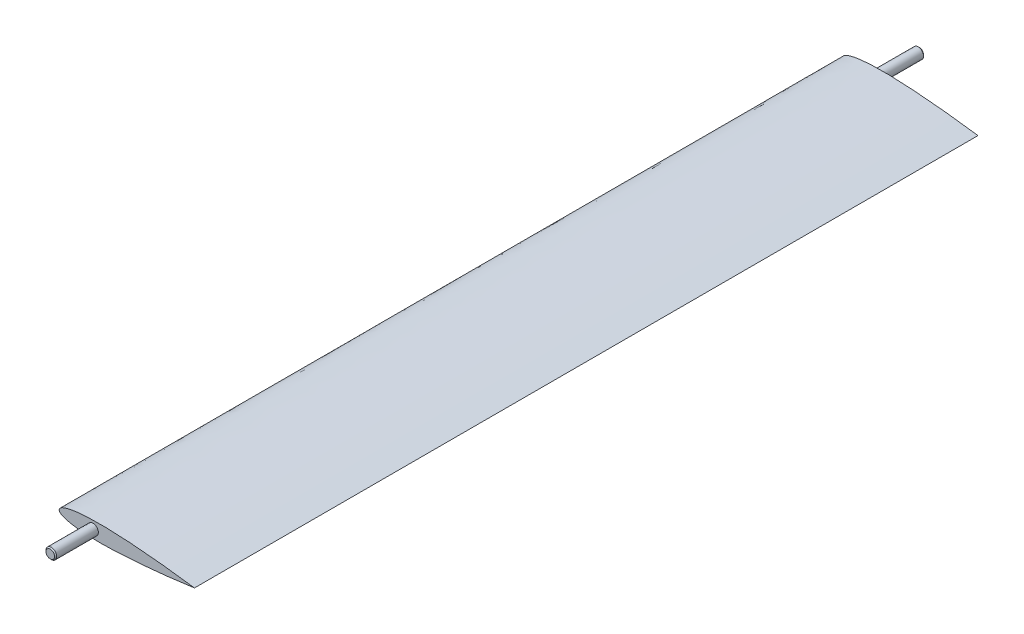
ISO-10303-21;
HEADER;
FILE_DESCRIPTION(('STEP AP214'),'2;1');
FILE_NAME('part.step','',(''),(''),'','','');
FILE_SCHEMA(('AUTOMOTIVE_DESIGN { 1 0 10303 214 1 1 1 1 }'));
ENDSEC;
DATA;
#1=APPLICATION_CONTEXT('core data for automotive mechanical design processes');
#2=APPLICATION_PROTOCOL_DEFINITION('international standard','automotive_design',2000,#1);
#3=PRODUCT_CONTEXT('',#1,'mechanical');
#4=PRODUCT('Part','Part','',(#3));
#5=PRODUCT_RELATED_PRODUCT_CATEGORY('part','',(#4));
#6=PRODUCT_DEFINITION_FORMATION('','',#4);
#7=PRODUCT_DEFINITION_CONTEXT('part definition',#1,'design');
#8=PRODUCT_DEFINITION('design','',#6,#7);
#9=PRODUCT_DEFINITION_SHAPE('','',#8);
#10=(LENGTH_UNIT() NAMED_UNIT(*) SI_UNIT(.MILLI.,.METRE.));
#11=(NAMED_UNIT(*) PLANE_ANGLE_UNIT() SI_UNIT($,.RADIAN.));
#12=(NAMED_UNIT(*) SI_UNIT($,.STERADIAN.) SOLID_ANGLE_UNIT());
#13=UNCERTAINTY_MEASURE_WITH_UNIT(LENGTH_MEASURE(1.E-05),#10,'distance_accuracy_value','');
#14=(GEOMETRIC_REPRESENTATION_CONTEXT(3) GLOBAL_UNCERTAINTY_ASSIGNED_CONTEXT((#13)) GLOBAL_UNIT_ASSIGNED_CONTEXT((#10,
#11,#12)) REPRESENTATION_CONTEXT('',''));
#15=CARTESIAN_POINT('',(0.,0.,0.));
#16=DIRECTION('',(0.,0.,1.));
#17=DIRECTION('',(1.,0.,0.));
#18=AXIS2_PLACEMENT_3D('',#15,#16,#17);
#19=CARTESIAN_POINT('',(18.7294114709245,-2.02546097018375,220.));
#20=DIRECTION('',(0.,0.,-1.));
#21=DIRECTION('',(-1.,0.,0.));
#22=AXIS2_PLACEMENT_3D('',#19,#20,#21);
#23=PLANE('',#22);
#24=CARTESIAN_POINT('',(9.5,0.,220.));
#25=DIRECTION('',(0.,0.,1.));
#26=DIRECTION('',(1.,0.,0.));
#27=AXIS2_PLACEMENT_3D('',#24,#25,#26);
#28=CIRCLE('',#27,1.5);
#29=CARTESIAN_POINT('',(11.,0.,220.));
#30=VERTEX_POINT('',#29);
#31=EDGE_CURVE('E224',#30,#30,#28,.T.);
#32=ORIENTED_EDGE('',*,*,#31,.F.);
#33=EDGE_LOOP('',(#32));
#34=FACE_BOUND('',#33,.T.);
#35=CARTESIAN_POINT('',(0.,0.,220.));
#36=CARTESIAN_POINT('',(-2.06911043078989E-06,-0.0338271220744024,220.));
#37=CARTESIAN_POINT('',(0.00403635311589506,-0.0876126358261565,220.));
#38=CARTESIAN_POINT('',(0.0188200562314085,-0.16185952748104,220.));
#39=CARTESIAN_POINT('',(0.0528501374643438,-0.253807517152681,220.));
#40=CARTESIAN_POINT('',(0.0947639989089038,-0.335316282668944,220.));
#41=CARTESIAN_POINT('',(0.15338616112402,-0.422711030479261,220.));
#42=CARTESIAN_POINT('',(0.236871710244544,-0.52106112737417,220.));
#43=CARTESIAN_POINT('',(0.360534512107286,-0.637189828483682,220.));
#44=CARTESIAN_POINT('',(0.549922371934611,-0.778618130341983,220.));
#45=CARTESIAN_POINT('',(0.852612628758095,-0.955990781417369,220.));
#46=CARTESIAN_POINT('',(1.33838174306882,-1.17360275032431,220.));
#47=CARTESIAN_POINT('',(2.12699066008119,-1.43620111728422,220.));
#48=CARTESIAN_POINT('',(3.44482494289274,-1.74535253826911,220.));
#49=CARTESIAN_POINT('',(5.3548767518104,-2.02711778446599,220.));
#50=CARTESIAN_POINT('',(7.77648688230715,-2.21985110884306,220.));
#51=CARTESIAN_POINT('',(10.5668143291997,-2.29867233686225,220.));
#52=CARTESIAN_POINT('',(13.467597852255,-2.27257110734628,220.));
#53=CARTESIAN_POINT('',(16.365165054022,-2.16727804219762,220.));
#54=CARTESIAN_POINT('',(19.2618490057873,-2.0013941708966,220.));
#55=CARTESIAN_POINT('',(21.7903998693664,-1.81523611830651,220.));
#56=CARTESIAN_POINT('',(23.9609885468039,-1.63075430288549,220.));
#57=CARTESIAN_POINT('',(25.7603134392892,-1.46376214884123,220.));
#58=CARTESIAN_POINT('',(27.2130418254588,-1.31996191843635,220.));
#59=CARTESIAN_POINT('',(28.9962984932699,-1.13500204529733,220.));
#60=CARTESIAN_POINT('',(30.8335668017185,-0.929187427247665,220.));
#61=CARTESIAN_POINT('',(32.5761475222131,-0.724154030900604,220.));
#62=CARTESIAN_POINT('',(34.4560407912972,-0.485464125489337,220.));
#63=CARTESIAN_POINT('',(35.7518272945925,-0.316113949746015,220.));
#64=CARTESIAN_POINT('',(37.0154592080796,-0.1398168008867,220.));
#65=CARTESIAN_POINT('',(37.6653217295886,-0.0470317833553604,220.));
#66=CARTESIAN_POINT('',(37.9888626445753,0.,220.));
#67=B_SPLINE_CURVE_WITH_KNOTS('',4,(#35,#36,#37,#38,#39,#40,#41,#42,#43,#44,#45,#46,#47,#48,#49,
#50,#51,#52,#53,#54,#55,#56,#57,#58,#59,#60,#61,#62,#63,#64,#65,#66),.UNSPECIFIED.,.F.,.F.,(5,1,
1,1,1,1,1,1,1,1,1,1,1,1,1,1,1,1,1,1,1,1,1,1,1,1,1,1,5),(0.,0.00316426122429357,
0.00506597876066756,0.00706776862449813,0.00918264952031766,0.0117519393359825,
0.0149267219917482,0.0191568446730158,0.0250795578902756,0.0339028131203275,0.0478066699856344,
0.0690496221158944,0.103020549952279,0.160853133365884,0.228931700635829,0.297010267730831,
0.365088836221598,0.433167405753562,0.501245974599692,0.569324543477579,0.603363828114539,
0.6374031127515,0.671442397407792,0.705481682064084,0.773560250012226,0.80759953409959,
0.841638818186954,0.875678103898654,0.90942695583692),.UNSPECIFIED.);
#68=CARTESIAN_POINT('',(0.,0.,220.));
#69=VERTEX_POINT('',#68);
#70=CARTESIAN_POINT('',(37.9888626445753,0.,220.));
#71=VERTEX_POINT('',#70);
#72=EDGE_CURVE('E185',#69,#71,#67,.T.);
#73=ORIENTED_EDGE('',*,*,#72,.T.);
#74=CARTESIAN_POINT('',(37.9888626445753,0.,220.));
#75=CARTESIAN_POINT('',(37.6653217295886,0.0470317833553604,220.));
#76=CARTESIAN_POINT('',(37.0154592080796,0.1398168008867,220.));
#77=CARTESIAN_POINT('',(35.7518272945925,0.316113949746015,220.));
#78=CARTESIAN_POINT('',(34.4560407912972,0.485464125489337,220.));
#79=CARTESIAN_POINT('',(32.5761475222131,0.724154030900604,220.));
#80=CARTESIAN_POINT('',(30.8335668017185,0.929187427247665,220.));
#81=CARTESIAN_POINT('',(28.9962984932699,1.13500204529733,220.));
#82=CARTESIAN_POINT('',(27.2130418254588,1.31996191843635,220.));
#83=CARTESIAN_POINT('',(25.7603134392892,1.46376214884123,220.));
#84=CARTESIAN_POINT('',(23.9609885468039,1.63075430288549,220.));
#85=CARTESIAN_POINT('',(21.7903998693664,1.81523611830651,220.));
#86=CARTESIAN_POINT('',(19.2618490057873,2.0013941708966,220.));
#87=CARTESIAN_POINT('',(16.365165054022,2.16727804219762,220.));
#88=CARTESIAN_POINT('',(13.467597852255,2.27257110734628,220.));
#89=CARTESIAN_POINT('',(10.5668143291997,2.29867233686225,220.));
#90=CARTESIAN_POINT('',(7.77648688230715,2.21985110884306,220.));
#91=CARTESIAN_POINT('',(5.3548767518104,2.02711778446599,220.));
#92=CARTESIAN_POINT('',(3.44482494289274,1.74535253826911,220.));
#93=CARTESIAN_POINT('',(2.12699066008119,1.43620111728422,220.));
#94=CARTESIAN_POINT('',(1.33838174306882,1.17360275032431,220.));
#95=CARTESIAN_POINT('',(0.852612628758095,0.955990781417369,220.));
#96=CARTESIAN_POINT('',(0.549922371934611,0.778618130341983,220.));
#97=CARTESIAN_POINT('',(0.360534512107286,0.637189828483682,220.));
#98=CARTESIAN_POINT('',(0.236871710244544,0.52106112737417,220.));
#99=CARTESIAN_POINT('',(0.15338616112402,0.422711030479261,220.));
#100=CARTESIAN_POINT('',(0.0947639989089038,0.335316282668944,220.));
#101=CARTESIAN_POINT('',(0.0528501374643438,0.253807517152681,220.));
#102=CARTESIAN_POINT('',(0.0188200562314085,0.16185952748104,220.));
#103=CARTESIAN_POINT('',(0.00403635311589506,0.0876126358261565,220.));
#104=CARTESIAN_POINT('',(-2.06911043078989E-06,0.0338271220744024,220.));
#105=CARTESIAN_POINT('',(0.,0.,220.));
#106=B_SPLINE_CURVE_WITH_KNOTS('',4,(#74,#75,#76,#77,#78,#79,#80,#81,#82,#83,#84,#85,#86,#87,
#88,#89,#90,#91,#92,#93,#94,#95,#96,#97,#98,#99,#100,#101,#102,#103,#104,#105),.UNSPECIFIED.,
.F.,.F.,(5,1,1,1,1,1,1,1,1,1,1,1,1,1,1,1,1,1,1,1,1,1,1,1,1,1,1,1,5),(0.,0.0337488519382667,
0.0677881376499663,0.101827421737331,0.135866705824695,0.203945273772837,0.237984558429129,
0.272023843085421,0.306063127722381,0.340102412359342,0.408180981237228,0.476259550083358,
0.544338119615323,0.612416688106089,0.680495255201092,0.748573822471036,0.806406405884641,
0.840377333721026,0.861620285851286,0.875524142716593,0.884347397946645,0.890270111163905,
0.894500233845172,0.897675016500938,0.900244306316603,0.902359187212422,0.904360977076253,
0.906262694612627,0.90942695583692),.UNSPECIFIED.);
#107=EDGE_CURVE('E187',#71,#69,#106,.T.);
#108=ORIENTED_EDGE('',*,*,#107,.T.);
#109=EDGE_LOOP('',(#73,#108));
#110=FACE_BOUND('',#109,.T.);
#111=ADVANCED_FACE('F45',(#34,#110),#23,.F.);
#112=CARTESIAN_POINT('',(18.7294114709245,-2.02546097018375,0.));
#113=DIRECTION('',(0.,0.,-1.));
#114=DIRECTION('',(-1.,0.,0.));
#115=AXIS2_PLACEMENT_3D('',#112,#113,#114);
#116=PLANE('',#115);
#117=CARTESIAN_POINT('',(9.5,0.,0.));
#118=DIRECTION('',(0.,0.,-1.));
#119=DIRECTION('',(-1.,0.,0.));
#120=AXIS2_PLACEMENT_3D('',#117,#118,#119);
#121=CIRCLE('',#120,1.5);
#122=CARTESIAN_POINT('',(8.,0.,0.));
#123=VERTEX_POINT('',#122);
#124=EDGE_CURVE('E120',#123,#123,#121,.T.);
#125=ORIENTED_EDGE('',*,*,#124,.F.);
#126=EDGE_LOOP('',(#125));
#127=FACE_BOUND('',#126,.T.);
#128=CARTESIAN_POINT('',(0.,0.,0.));
#129=CARTESIAN_POINT('',(-2.06911043078989E-06,-0.0338271220744024,0.));
#130=CARTESIAN_POINT('',(0.00403635311589506,-0.0876126358261565,0.));
#131=CARTESIAN_POINT('',(0.0188200562314085,-0.16185952748104,0.));
#132=CARTESIAN_POINT('',(0.0528501374643438,-0.253807517152681,0.));
#133=CARTESIAN_POINT('',(0.0947639989089038,-0.335316282668944,0.));
#134=CARTESIAN_POINT('',(0.15338616112402,-0.422711030479261,0.));
#135=CARTESIAN_POINT('',(0.236871710244544,-0.52106112737417,0.));
#136=CARTESIAN_POINT('',(0.360534512107286,-0.637189828483682,0.));
#137=CARTESIAN_POINT('',(0.549922371934611,-0.778618130341983,0.));
#138=CARTESIAN_POINT('',(0.852612628758095,-0.955990781417369,0.));
#139=CARTESIAN_POINT('',(1.33838174306882,-1.17360275032431,0.));
#140=CARTESIAN_POINT('',(2.12699066008119,-1.43620111728422,0.));
#141=CARTESIAN_POINT('',(3.44482494289274,-1.74535253826911,0.));
#142=CARTESIAN_POINT('',(5.3548767518104,-2.02711778446599,0.));
#143=CARTESIAN_POINT('',(7.77648688230715,-2.21985110884306,0.));
#144=CARTESIAN_POINT('',(10.5668143291997,-2.29867233686225,0.));
#145=CARTESIAN_POINT('',(13.467597852255,-2.27257110734628,0.));
#146=CARTESIAN_POINT('',(16.365165054022,-2.16727804219762,0.));
#147=CARTESIAN_POINT('',(19.2618490057873,-2.0013941708966,0.));
#148=CARTESIAN_POINT('',(21.7903998693664,-1.81523611830651,0.));
#149=CARTESIAN_POINT('',(23.9609885468039,-1.63075430288549,0.));
#150=CARTESIAN_POINT('',(25.7603134392892,-1.46376214884123,0.));
#151=CARTESIAN_POINT('',(27.2130418254588,-1.31996191843635,0.));
#152=CARTESIAN_POINT('',(28.9962984932699,-1.13500204529733,0.));
#153=CARTESIAN_POINT('',(30.8335668017185,-0.929187427247665,0.));
#154=CARTESIAN_POINT('',(32.5761475222131,-0.724154030900604,0.));
#155=CARTESIAN_POINT('',(34.4560407912972,-0.485464125489337,0.));
#156=CARTESIAN_POINT('',(35.7518272945925,-0.316113949746015,0.));
#157=CARTESIAN_POINT('',(37.0154592080796,-0.1398168008867,0.));
#158=CARTESIAN_POINT('',(37.6653217295886,-0.0470317833553604,0.));
#159=CARTESIAN_POINT('',(37.9888626445753,0.,0.));
#160=B_SPLINE_CURVE_WITH_KNOTS('',4,(#128,#129,#130,#131,#132,#133,#134,#135,#136,#137,#138,
#139,#140,#141,#142,#143,#144,#145,#146,#147,#148,#149,#150,#151,#152,#153,#154,#155,#156,#157,
#158,#159),.UNSPECIFIED.,.F.,.F.,(5,1,1,1,1,1,1,1,1,1,1,1,1,1,1,1,1,1,1,1,1,1,1,1,1,1,1,1,5),
(0.,0.00316426122429357,0.00506597876066756,0.00706776862449813,0.00918264952031766,
0.0117519393359825,0.0149267219917482,0.0191568446730158,0.0250795578902756,0.0339028131203275,
0.0478066699856344,0.0690496221158944,0.103020549952279,0.160853133365884,0.228931700635829,
0.297010267730831,0.365088836221598,0.433167405753562,0.501245974599692,0.569324543477579,
0.603363828114539,0.6374031127515,0.671442397407792,0.705481682064084,0.773560250012226,
0.80759953409959,0.841638818186954,0.875678103898654,0.90942695583692),.UNSPECIFIED.);
#161=CARTESIAN_POINT('',(0.,0.,0.));
#162=VERTEX_POINT('',#161);
#163=CARTESIAN_POINT('',(37.9888626445753,0.,0.));
#164=VERTEX_POINT('',#163);
#165=EDGE_CURVE('E181',#162,#164,#160,.T.);
#166=ORIENTED_EDGE('',*,*,#165,.F.);
#167=CARTESIAN_POINT('',(37.9888626445753,0.,0.));
#168=CARTESIAN_POINT('',(37.6653217295886,0.0470317833553604,0.));
#169=CARTESIAN_POINT('',(37.0154592080796,0.1398168008867,0.));
#170=CARTESIAN_POINT('',(35.7518272945925,0.316113949746015,0.));
#171=CARTESIAN_POINT('',(34.4560407912972,0.485464125489337,0.));
#172=CARTESIAN_POINT('',(32.5761475222131,0.724154030900604,0.));
#173=CARTESIAN_POINT('',(30.8335668017185,0.929187427247665,0.));
#174=CARTESIAN_POINT('',(28.9962984932699,1.13500204529733,0.));
#175=CARTESIAN_POINT('',(27.2130418254588,1.31996191843635,0.));
#176=CARTESIAN_POINT('',(25.7603134392892,1.46376214884123,0.));
#177=CARTESIAN_POINT('',(23.9609885468039,1.63075430288549,0.));
#178=CARTESIAN_POINT('',(21.7903998693664,1.81523611830651,0.));
#179=CARTESIAN_POINT('',(19.2618490057873,2.0013941708966,0.));
#180=CARTESIAN_POINT('',(16.365165054022,2.16727804219762,0.));
#181=CARTESIAN_POINT('',(13.467597852255,2.27257110734628,0.));
#182=CARTESIAN_POINT('',(10.5668143291997,2.29867233686225,0.));
#183=CARTESIAN_POINT('',(7.77648688230715,2.21985110884306,0.));
#184=CARTESIAN_POINT('',(5.3548767518104,2.02711778446599,0.));
#185=CARTESIAN_POINT('',(3.44482494289274,1.74535253826911,0.));
#186=CARTESIAN_POINT('',(2.12699066008119,1.43620111728422,0.));
#187=CARTESIAN_POINT('',(1.33838174306882,1.17360275032431,0.));
#188=CARTESIAN_POINT('',(0.852612628758095,0.955990781417369,0.));
#189=CARTESIAN_POINT('',(0.549922371934611,0.778618130341983,0.));
#190=CARTESIAN_POINT('',(0.360534512107286,0.637189828483682,0.));
#191=CARTESIAN_POINT('',(0.236871710244544,0.52106112737417,0.));
#192=CARTESIAN_POINT('',(0.15338616112402,0.422711030479261,0.));
#193=CARTESIAN_POINT('',(0.0947639989089038,0.335316282668944,0.));
#194=CARTESIAN_POINT('',(0.0528501374643438,0.253807517152681,0.));
#195=CARTESIAN_POINT('',(0.0188200562314085,0.16185952748104,0.));
#196=CARTESIAN_POINT('',(0.00403635311589506,0.0876126358261565,0.));
#197=CARTESIAN_POINT('',(-2.06911043078989E-06,0.0338271220744024,0.));
#198=CARTESIAN_POINT('',(0.,0.,0.));
#199=B_SPLINE_CURVE_WITH_KNOTS('',4,(#167,#168,#169,#170,#171,#172,#173,#174,#175,#176,#177,
#178,#179,#180,#181,#182,#183,#184,#185,#186,#187,#188,#189,#190,#191,#192,#193,#194,#195,#196,
#197,#198),.UNSPECIFIED.,.F.,.F.,(5,1,1,1,1,1,1,1,1,1,1,1,1,1,1,1,1,1,1,1,1,1,1,1,1,1,1,1,5),
(0.,0.0337488519382667,0.0677881376499663,0.101827421737331,0.135866705824695,0.203945273772837,
0.237984558429129,0.272023843085421,0.306063127722381,0.340102412359342,0.408180981237228,
0.476259550083358,0.544338119615323,0.612416688106089,0.680495255201092,0.748573822471036,
0.806406405884641,0.840377333721026,0.861620285851286,0.875524142716593,0.884347397946645,
0.890270111163905,0.894500233845172,0.897675016500938,0.900244306316603,0.902359187212422,
0.904360977076253,0.906262694612627,0.90942695583692),.UNSPECIFIED.);
#200=EDGE_CURVE('E191',#164,#162,#199,.T.);
#201=ORIENTED_EDGE('',*,*,#200,.F.);
#202=EDGE_LOOP('',(#166,#201));
#203=FACE_BOUND('',#202,.T.);
#204=ADVANCED_FACE('F202',(#127,#203),#116,.T.);
#205=DIRECTION('',(0.,0.,-1.));
#206=VECTOR('',#205,1.);
#207=SURFACE_OF_LINEAR_EXTRUSION('',#67,#206);
#208=DIRECTION('',(0.,0.,-1.));
#209=VECTOR('',#208,1.);
#210=CARTESIAN_POINT('',(0.,0.,220.));
#211=LINE('',#210,#209);
#212=EDGE_CURVE('E239',#69,#162,#211,.T.);
#213=ORIENTED_EDGE('',*,*,#212,.T.);
#214=ORIENTED_EDGE('',*,*,#165,.T.);
#215=DIRECTION('',(0.,0.,-1.));
#216=VECTOR('',#215,1.);
#217=CARTESIAN_POINT('',(37.9888626445753,0.,220.));
#218=LINE('',#217,#216);
#219=EDGE_CURVE('E226',#71,#164,#218,.T.);
#220=ORIENTED_EDGE('',*,*,#219,.F.);
#221=ORIENTED_EDGE('',*,*,#72,.F.);
#222=EDGE_LOOP('',(#213,#214,#220,#221));
#223=FACE_BOUND('',#222,.T.);
#224=ADVANCED_FACE('F199',(#223),#207,.F.);
#225=DIRECTION('',(0.,0.,-1.));
#226=VECTOR('',#225,1.);
#227=SURFACE_OF_LINEAR_EXTRUSION('',#106,#226);
#228=ORIENTED_EDGE('',*,*,#219,.T.);
#229=ORIENTED_EDGE('',*,*,#200,.T.);
#230=ORIENTED_EDGE('',*,*,#212,.F.);
#231=ORIENTED_EDGE('',*,*,#107,.F.);
#232=EDGE_LOOP('',(#228,#229,#230,#231));
#233=FACE_BOUND('',#232,.T.);
#234=ADVANCED_FACE('F147',(#233),#227,.F.);
#235=CARTESIAN_POINT('',(9.5,0.,232.));
#236=DIRECTION('',(0.,0.,-1.));
#237=DIRECTION('',(-1.,0.,0.));
#238=AXIS2_PLACEMENT_3D('',#235,#236,#237);
#239=CYLINDRICAL_SURFACE('',#238,1.5);
#240=CARTESIAN_POINT('',(9.5,0.,231.7));
#241=DIRECTION('',(0.,0.,1.));
#242=DIRECTION('',(1.,0.,0.));
#243=AXIS2_PLACEMENT_3D('',#240,#241,#242);
#244=CIRCLE('',#243,1.5);
#245=CARTESIAN_POINT('',(11.,0.,231.7));
#246=VERTEX_POINT('',#245);
#247=EDGE_CURVE('E121',#246,#246,#244,.F.);
#248=ORIENTED_EDGE('',*,*,#247,.T.);
#249=EDGE_LOOP('',(#248));
#250=FACE_BOUND('',#249,.T.);
#251=ORIENTED_EDGE('',*,*,#31,.T.);
#252=EDGE_LOOP('',(#251));
#253=FACE_BOUND('',#252,.T.);
#254=ADVANCED_FACE('F142',(#250,#253),#239,.T.);
#255=CARTESIAN_POINT('',(9.5,0.,232.));
#256=DIRECTION('',(0.,0.,1.));
#257=DIRECTION('',(1.,0.,0.));
#258=AXIS2_PLACEMENT_3D('',#255,#256,#257);
#259=PLANE('',#258);
#260=CARTESIAN_POINT('',(9.5,0.,232.));
#261=DIRECTION('',(0.,0.,1.));
#262=DIRECTION('',(1.,0.,0.));
#263=AXIS2_PLACEMENT_3D('',#260,#261,#262);
#264=CIRCLE('',#263,1.20000000000001);
#265=CARTESIAN_POINT('',(10.7,0.,232.));
#266=VERTEX_POINT('',#265);
#267=EDGE_CURVE('E249',#266,#266,#264,.T.);
#268=ORIENTED_EDGE('',*,*,#267,.T.);
#269=EDGE_LOOP('',(#268));
#270=FACE_BOUND('',#269,.T.);
#271=ADVANCED_FACE('F141',(#270),#259,.T.);
#272=CARTESIAN_POINT('',(9.5,0.,232.));
#273=DIRECTION('',(0.,0.,-1.));
#274=DIRECTION('',(-1.,0.,0.));
#275=AXIS2_PLACEMENT_3D('',#272,#273,#274);
#276=CONICAL_SURFACE('',#275,1.20000000000001,0.785398163397441);
#277=ORIENTED_EDGE('',*,*,#247,.F.);
#278=EDGE_LOOP('',(#277));
#279=FACE_BOUND('',#278,.T.);
#280=ORIENTED_EDGE('',*,*,#267,.F.);
#281=EDGE_LOOP('',(#280));
#282=FACE_BOUND('',#281,.T.);
#283=ADVANCED_FACE('F137',(#279,#282),#276,.T.);
#284=CARTESIAN_POINT('',(9.5,0.,-12.));
#285=DIRECTION('',(0.,0.,1.));
#286=DIRECTION('',(1.,0.,0.));
#287=AXIS2_PLACEMENT_3D('',#284,#285,#286);
#288=CYLINDRICAL_SURFACE('',#287,1.5);
#289=CARTESIAN_POINT('',(9.5,0.,-11.7));
#290=DIRECTION('',(0.,0.,-1.));
#291=DIRECTION('',(-1.,0.,0.));
#292=AXIS2_PLACEMENT_3D('',#289,#290,#291);
#293=CIRCLE('',#292,1.5);
#294=CARTESIAN_POINT('',(8.5,-1.11803398874989,-11.7));
#295=VERTEX_POINT('',#294);
#296=CARTESIAN_POINT('',(8.5,1.11803398874989,-11.7));
#297=VERTEX_POINT('',#296);
#298=EDGE_CURVE('E116',#295,#297,#293,.F.);
#299=ORIENTED_EDGE('',*,*,#298,.T.);
#300=DIRECTION('',(0.,0.,1.));
#301=VECTOR('',#300,1.);
#302=CARTESIAN_POINT('',(8.5,1.11803398874989,-12.));
#303=LINE('',#302,#301);
#304=CARTESIAN_POINT('',(8.5,1.11803398874989,-6.));
#305=VERTEX_POINT('',#304);
#306=EDGE_CURVE('E105',#297,#305,#303,.T.);
#307=ORIENTED_EDGE('',*,*,#306,.T.);
#308=CARTESIAN_POINT('',(9.5,0.,-6.));
#309=DIRECTION('',(0.,0.,-1.));
#310=DIRECTION('',(-1.,0.,0.));
#311=AXIS2_PLACEMENT_3D('',#308,#309,#310);
#312=CIRCLE('',#311,1.5);
#313=CARTESIAN_POINT('',(8.5,-1.11803398874989,-6.));
#314=VERTEX_POINT('',#313);
#315=EDGE_CURVE('E11',#314,#305,#312,.T.);
#316=ORIENTED_EDGE('',*,*,#315,.F.);
#317=DIRECTION('',(0.,0.,1.));
#318=VECTOR('',#317,1.);
#319=CARTESIAN_POINT('',(8.5,-1.11803398874989,-12.));
#320=LINE('',#319,#318);
#321=EDGE_CURVE('E381',#314,#295,#320,.F.);
#322=ORIENTED_EDGE('',*,*,#321,.T.);
#323=EDGE_LOOP('',(#299,#307,#316,#322));
#324=FACE_BOUND('',#323,.T.);
#325=ORIENTED_EDGE('',*,*,#124,.T.);
#326=EDGE_LOOP('',(#325));
#327=FACE_BOUND('',#326,.T.);
#328=ADVANCED_FACE('F136',(#324,#327),#288,.T.);
#329=CARTESIAN_POINT('',(9.5,0.,-12.));
#330=DIRECTION('',(0.,0.,-1.));
#331=DIRECTION('',(-1.,0.,0.));
#332=AXIS2_PLACEMENT_3D('',#329,#330,#331);
#333=PLANE('',#332);
#334=DIRECTION('',(0.,-1.,0.));
#335=VECTOR('',#334,1.);
#336=CARTESIAN_POINT('',(8.5,1.74994964743518,-12.));
#337=LINE('',#336,#335);
#338=CARTESIAN_POINT('',(8.5,0.663324958070993,-12.));
#339=VERTEX_POINT('',#338);
#340=CARTESIAN_POINT('',(8.5,-0.663324958070993,-12.));
#341=VERTEX_POINT('',#340);
#342=EDGE_CURVE('E58',#339,#341,#337,.T.);
#343=ORIENTED_EDGE('',*,*,#342,.F.);
#344=CARTESIAN_POINT('',(9.5,0.,-12.));
#345=DIRECTION('',(0.,0.,-1.));
#346=DIRECTION('',(-1.,0.,0.));
#347=AXIS2_PLACEMENT_3D('',#344,#345,#346);
#348=CIRCLE('',#347,1.19999999999995);
#349=EDGE_CURVE('E111',#339,#341,#348,.T.);
#350=ORIENTED_EDGE('',*,*,#349,.T.);
#351=EDGE_LOOP('',(#343,#350));
#352=FACE_BOUND('',#351,.T.);
#353=ADVANCED_FACE('F115',(#352),#333,.T.);
#354=CARTESIAN_POINT('',(9.5,0.,-12.));
#355=DIRECTION('',(0.,0.,1.));
#356=DIRECTION('',(1.,0.,0.));
#357=AXIS2_PLACEMENT_3D('',#354,#355,#356);
#358=CONICAL_SURFACE('',#357,1.19999999999995,0.78539816339747);
#359=CARTESIAN_POINT('',(8.5,1.11897296213984,-11.6993));
#360=CARTESIAN_POINT('',(8.5,1.09024222016785,-11.7207187328309));
#361=CARTESIAN_POINT('',(8.5,1.06134026006022,-11.7419071026151));
#362=CARTESIAN_POINT('',(8.5,1.00312061656177,-11.7837236259047));
#363=CARTESIAN_POINT('',(8.5,0.973802805615169,-11.804351601603));
#364=CARTESIAN_POINT('',(8.5,0.884567468967959,-11.865620617618));
#365=CARTESIAN_POINT('',(8.5,0.823924913388943,-11.9052254029843));
#366=CARTESIAN_POINT('',(8.5,0.696784081134469,-11.9822962516306));
#367=CARTESIAN_POINT('',(8.5,0.630146054569554,-12.019534969933));
#368=CARTESIAN_POINT('',(8.5,0.493354129612926,-12.0865050319625));
#369=CARTESIAN_POINT('',(8.5,0.423216912285792,-12.1162685490799));
#370=CARTESIAN_POINT('',(8.5,0.317202245435414,-12.1513827077401));
#371=CARTESIAN_POINT('',(8.5,0.282850113782415,-12.1613149000477));
#372=CARTESIAN_POINT('',(8.5,0.213373247303245,-12.1780449996244));
#373=CARTESIAN_POINT('',(8.5,0.178248488865912,-12.1848428109683));
#374=CARTESIAN_POINT('',(8.5,0.108142066473121,-12.1947564692436));
#375=CARTESIAN_POINT('',(8.5,0.0731699498529088,-12.1979386170484));
#376=CARTESIAN_POINT('',(8.5,0.00308421194416662,-12.2006082365864));
#377=CARTESIAN_POINT('',(8.5,-0.0320293978937862,-12.200096001522));
#378=CARTESIAN_POINT('',(8.5,-0.101972162328689,-12.1954199205539));
#379=CARTESIAN_POINT('',(8.5,-0.136801563849377,-12.1912596856238));
#380=CARTESIAN_POINT('',(8.5,-0.205897926419696,-12.1795919858713));
#381=CARTESIAN_POINT('',(8.5,-0.240164653325983,-12.1720831624685));
#382=CARTESIAN_POINT('',(8.5,-0.308544265543494,-12.1540120518751));
#383=CARTESIAN_POINT('',(8.5,-0.342642782255095,-12.1433962477893));
#384=CARTESIAN_POINT('',(8.5,-0.409953485208609,-12.1196898228485));
#385=CARTESIAN_POINT('',(8.5,-0.443165687264662,-12.1065992461836));
#386=CARTESIAN_POINT('',(8.5,-0.535214038947426,-12.0670481624514));
#387=CARTESIAN_POINT('',(8.5,-0.593075519908671,-12.0383299431418));
#388=CARTESIAN_POINT('',(8.5,-0.70648251748682,-11.9765388022821));
#389=CARTESIAN_POINT('',(8.5,-0.762023712509308,-11.9434581936325));
#390=CARTESIAN_POINT('',(8.5,-0.868579685508135,-11.8760643674979));
#391=CARTESIAN_POINT('',(8.5,-0.919683166917566,-11.8418896681839));
#392=CARTESIAN_POINT('',(8.5,-1.02033972588607,-11.7717707222928));
#393=CARTESIAN_POINT('',(8.5,-1.06989854885271,-11.7358347605053));
#394=CARTESIAN_POINT('',(8.5,-1.11897296213983,-11.6993));
#395=B_SPLINE_CURVE_WITH_KNOTS('',3,(#359,#360,#361,#362,#363,#364,#365,#366,#367,#368,#369,
#370,#371,#372,#373,#374,#375,#376,#377,#378,#379,#380,#381,#382,#383,#384,#385,#386,#387,#388,
#389,#390,#391,#392,#393,#394),.UNSPECIFIED.,.F.,.F.,(4,2,2,2,2,2,2,2,2,2,2,2,2,2,2,2,2,4),(0.,
0.107504690946426,0.215043102750852,0.432213334337307,0.660987336316715,0.888759133201626,
0.995917363996136,1.10307887406489,1.20824192609617,1.31339663202167,1.41844736788724,
1.52354076348777,1.63056316104886,1.73758364777582,1.93106053361945,2.12488302407808,
2.30926491601929,2.49285004928371),.UNSPECIFIED.);
#396=EDGE_CURVE('E52',#297,#339,#395,.T.);
#397=ORIENTED_EDGE('',*,*,#396,.F.);
#398=ORIENTED_EDGE('',*,*,#298,.F.);
#399=EDGE_CURVE('E110',#341,#295,#395,.T.);
#400=ORIENTED_EDGE('',*,*,#399,.F.);
#401=ORIENTED_EDGE('',*,*,#349,.F.);
#402=EDGE_LOOP('',(#397,#398,#400,#401));
#403=FACE_BOUND('',#402,.T.);
#404=ADVANCED_FACE('F44',(#403),#358,.T.);
#405=CARTESIAN_POINT('',(0.,0.,-6.));
#406=DIRECTION('',(0.,0.,-1.));
#407=DIRECTION('',(-1.,0.,0.));
#408=AXIS2_PLACEMENT_3D('',#405,#406,#407);
#409=PLANE('',#408);
#410=ORIENTED_EDGE('',*,*,#315,.T.);
#411=DIRECTION('',(0.,-1.,0.));
#412=VECTOR('',#411,1.);
#413=CARTESIAN_POINT('',(8.5,1.74994964743518,-6.));
#414=LINE('',#413,#412);
#415=EDGE_CURVE('E114',#305,#314,#414,.T.);
#416=ORIENTED_EDGE('',*,*,#415,.T.);
#417=EDGE_LOOP('',(#410,#416));
#418=FACE_BOUND('',#417,.T.);
#419=ADVANCED_FACE('F131',(#418),#409,.T.);
#420=CARTESIAN_POINT('',(8.5,1.74994964743518,-6.));
#421=DIRECTION('',(1.,0.,0.));
#422=DIRECTION('',(0.,1.,0.));
#423=AXIS2_PLACEMENT_3D('',#420,#421,#422);
#424=PLANE('',#423);
#425=ORIENTED_EDGE('',*,*,#396,.T.);
#426=ORIENTED_EDGE('',*,*,#342,.T.);
#427=ORIENTED_EDGE('',*,*,#399,.T.);
#428=ORIENTED_EDGE('',*,*,#321,.F.);
#429=ORIENTED_EDGE('',*,*,#415,.F.);
#430=ORIENTED_EDGE('',*,*,#306,.F.);
#431=EDGE_LOOP('',(#425,#426,#427,#428,#429,#430));
#432=FACE_BOUND('',#431,.T.);
#433=ADVANCED_FACE('F103',(#432),#424,.F.);
#434=CLOSED_SHELL('',(#111,#204,#224,#234,#254,#271,#283,#328,#353,#404,#419,#433));
#435=CARTESIAN_POINT('',(18.7294114709245,-2.02546097018375,217.));
#436=DIRECTION('',(0.,0.,-1.));
#437=DIRECTION('',(-1.,0.,0.));
#438=AXIS2_PLACEMENT_3D('',#435,#436,#437);
#439=PLANE('',#438);
#440=CARTESIAN_POINT('',(36.2181509442796,-3.10593257113901E-09,217.));
#441=CARTESIAN_POINT('',(35.6667574294242,0.0752799700977853,217.));
#442=CARTESIAN_POINT('',(34.7465554750795,0.197696984360652,217.));
#443=CARTESIAN_POINT('',(33.3534334594213,0.378292675830032,217.));
#444=CARTESIAN_POINT('',(31.714387446645,0.574754133636344,217.));
#445=CARTESIAN_POINT('',(30.1604711723445,0.755675098172465,217.));
#446=CARTESIAN_POINT('',(28.6685782538429,0.918293595335739,217.));
#447=CARTESIAN_POINT('',(27.1389367718933,1.07815769213123,217.));
#448=CARTESIAN_POINT('',(25.2488465829163,1.2635436809688,217.));
#449=CARTESIAN_POINT('',(22.9665535034804,1.46977577366449,217.));
#450=CARTESIAN_POINT('',(20.3090079877748,1.68014267805545,217.));
#451=CARTESIAN_POINT('',(17.2636148185309,1.87286229536893,217.));
#452=CARTESIAN_POINT('',(14.2173994689365,2.00363177057367,217.));
#453=CARTESIAN_POINT('',(11.1670564837462,2.05318487935292,217.));
#454=CARTESIAN_POINT('',(8.21796201296184,1.99338184894951,217.));
#455=CARTESIAN_POINT('',(5.65475122119362,1.81110459322899,217.));
#456=CARTESIAN_POINT('',(3.62775364700071,1.53047268112544,217.));
#457=CARTESIAN_POINT('',(2.22484840217689,1.21396395558367,217.));
#458=CARTESIAN_POINT('',(1.39474049158263,0.945592534698617,217.));
#459=CARTESIAN_POINT('',(0.884881516853307,0.722580332699066,217.));
#460=CARTESIAN_POINT('',(0.569226758306986,0.541405227935905,217.));
#461=CARTESIAN_POINT('',(0.372671717286558,0.397415308291281,217.));
#462=CARTESIAN_POINT('',(0.244468490309658,0.279049741612686,217.));
#463=CARTESIAN_POINT('',(0.150275243456082,0.169887664191104,217.));
#464=CARTESIAN_POINT('',(0.0965635723245372,0.088381351978281,217.));
#465=CARTESIAN_POINT('',(0.0676066360044371,0.0323421254722937,217.));
#466=CARTESIAN_POINT('',(0.0535258097611103,-1.80035666245742E-10,217.));
#467=B_SPLINE_CURVE_WITH_KNOTS('',4,(#440,#441,#442,#443,#444,#445,#446,#447,#448,#449,#450,
#451,#452,#453,#454,#455,#456,#457,#458,#459,#460,#461,#462,#463,#464,#465,#466),.UNSPECIFIED.,
.F.,.F.,(5,1,1,1,1,1,1,1,1,1,1,1,1,1,1,1,1,1,1,1,1,1,1,5),(0.00574382269176105,
0.0566870768024412,0.0907008313537327,0.124714585905024,0.158728339984373,0.192742094063723,
0.2267558479962,0.260769601928677,0.328797109871591,0.396824617869176,0.464852125529413,
0.532879632440458,0.600907139400756,0.668934641432015,0.727991986688695,0.762005659857759,
0.783315408219697,0.797096518365796,0.805725042983471,0.811570113252977,0.815726951684336,
0.818792340436391,0.821261273346188,0.824408571069677),.UNSPECIFIED.);
#468=CARTESIAN_POINT('',(0.0535258097611103,-1.80035666245742E-10,217.));
#469=VERTEX_POINT('',#468);
#470=CARTESIAN_POINT('',(36.2181509442796,-3.10593257113901E-09,217.));
#471=VERTEX_POINT('',#470);
#472=EDGE_CURVE('E70',#469,#471,#467,.F.);
#473=ORIENTED_EDGE('',*,*,#472,.T.);
#474=CARTESIAN_POINT('',(0.0535258097611105,-1.80035164166963E-10,217.));
#475=CARTESIAN_POINT('',(0.0676066359810806,-0.0323421257527528,217.));
#476=CARTESIAN_POINT('',(0.0965635722689586,-0.0883813521817063,217.));
#477=CARTESIAN_POINT('',(0.150275243349579,-0.169887664328279,217.));
#478=CARTESIAN_POINT('',(0.244468490130668,-0.279049741703487,217.));
#479=CARTESIAN_POINT('',(0.372671717087385,-0.397415308403943,217.));
#480=CARTESIAN_POINT('',(0.569226758083259,-0.541405228082083,217.));
#481=CARTESIAN_POINT('',(0.884881516598687,-0.722580332899069,217.));
#482=CARTESIAN_POINT('',(1.39474049128998,-0.94559253498556,217.));
#483=CARTESIAN_POINT('',(2.22484840183848,-1.21396395601217,217.));
#484=CARTESIAN_POINT('',(3.62775364660833,-1.53047268179315,217.));
#485=CARTESIAN_POINT('',(5.65475122075338,-1.81110459424234,217.));
#486=CARTESIAN_POINT('',(8.21796201249052,-1.99338185039993,217.));
#487=CARTESIAN_POINT('',(11.1670564832647,-2.05318488130621,217.));
#488=CARTESIAN_POINT('',(14.2173994684634,-2.0036317730471,217.));
#489=CARTESIAN_POINT('',(17.2636148180801,-1.8728622983618,217.));
#490=CARTESIAN_POINT('',(20.3090079873569,-1.68014268156761,217.));
#491=CARTESIAN_POINT('',(22.9665535030983,-1.46977577762982,217.));
#492=CARTESIAN_POINT('',(25.2488465825694,-1.26354368532329,217.));
#493=CARTESIAN_POINT('',(27.138936771578,-1.07815769680802,217.));
#494=CARTESIAN_POINT('',(28.6685782535549,-0.918293600273358,217.));
#495=CARTESIAN_POINT('',(30.1604711720842,-0.755675103364479,217.));
#496=CARTESIAN_POINT('',(31.7143874464156,-0.574754139093328,217.));
#497=CARTESIAN_POINT('',(33.3534334592534,-0.378292681563138,217.));
#498=CARTESIAN_POINT('',(34.7465554749757,-0.197696990326721,217.));
#499=CARTESIAN_POINT('',(35.6667574293652,-0.0752799762173787,217.));
#500=CARTESIAN_POINT('',(36.2181509442618,-3.10350692288796E-09,217.));
#501=B_SPLINE_CURVE_WITH_KNOTS('',4,(#474,#475,#476,#477,#478,#479,#480,#481,#482,#483,#484,
#485,#486,#487,#488,#489,#490,#491,#492,#493,#494,#495,#496,#497,#498,#499,#500),.UNSPECIFIED.,
.F.,.F.,(5,1,1,1,1,1,1,1,1,1,1,1,1,1,1,1,1,1,1,1,1,1,1,5),(0.00574382269910399,
0.00889112041524977,0.0113600533250474,0.0144254420771025,0.0185822805084611,0.0244273507779674,
0.0330558753956419,0.0468369855417409,0.068146733903679,0.102160407072743,0.161217752329423,
0.229245254360682,0.29727276132098,0.365300268232025,0.433327775892262,0.501355283889847,
0.569382791832761,0.603396545765238,0.637410299697715,0.671424053777065,0.705437807856414,
0.739451562407705,0.773465316958997,0.824408571072297),.UNSPECIFIED.);
#502=EDGE_CURVE('E263',#471,#469,#501,.F.);
#503=ORIENTED_EDGE('',*,*,#502,.T.);
#504=EDGE_LOOP('',(#473,#503));
#505=FACE_BOUND('',#504,.T.);
#506=ADVANCED_FACE('F153',(#505),#439,.T.);
#507=CARTESIAN_POINT('',(18.7294114709245,-2.02546097018375,3.));
#508=DIRECTION('',(0.,0.,-1.));
#509=DIRECTION('',(-1.,0.,0.));
#510=AXIS2_PLACEMENT_3D('',#507,#508,#509);
#511=PLANE('',#510);
#512=CARTESIAN_POINT('',(0.0535258097611105,-1.80035164166963E-10,3.));
#513=CARTESIAN_POINT('',(0.0676066359810806,-0.0323421257527528,3.));
#514=CARTESIAN_POINT('',(0.0965635722689586,-0.0883813521817063,3.));
#515=CARTESIAN_POINT('',(0.150275243349579,-0.169887664328279,3.));
#516=CARTESIAN_POINT('',(0.244468490130668,-0.279049741703487,3.));
#517=CARTESIAN_POINT('',(0.372671717087385,-0.397415308403943,3.));
#518=CARTESIAN_POINT('',(0.569226758083259,-0.541405228082083,3.));
#519=CARTESIAN_POINT('',(0.884881516598687,-0.722580332899069,3.));
#520=CARTESIAN_POINT('',(1.39474049128998,-0.94559253498556,3.));
#521=CARTESIAN_POINT('',(2.22484840183848,-1.21396395601217,3.));
#522=CARTESIAN_POINT('',(3.62775364660833,-1.53047268179315,3.));
#523=CARTESIAN_POINT('',(5.65475122075338,-1.81110459424234,3.));
#524=CARTESIAN_POINT('',(8.21796201249052,-1.99338185039993,3.));
#525=CARTESIAN_POINT('',(11.1670564832647,-2.05318488130621,3.));
#526=CARTESIAN_POINT('',(14.2173994684634,-2.0036317730471,3.));
#527=CARTESIAN_POINT('',(17.2636148180801,-1.8728622983618,3.));
#528=CARTESIAN_POINT('',(20.3090079873569,-1.68014268156761,3.));
#529=CARTESIAN_POINT('',(22.9665535030983,-1.46977577762982,3.));
#530=CARTESIAN_POINT('',(25.2488465825694,-1.26354368532329,3.));
#531=CARTESIAN_POINT('',(27.138936771578,-1.07815769680802,3.));
#532=CARTESIAN_POINT('',(28.6685782535549,-0.918293600273358,3.));
#533=CARTESIAN_POINT('',(30.1604711720842,-0.755675103364479,3.));
#534=CARTESIAN_POINT('',(31.7143874464156,-0.574754139093328,3.));
#535=CARTESIAN_POINT('',(33.3534334592534,-0.378292681563138,3.));
#536=CARTESIAN_POINT('',(34.7465554749757,-0.197696990326721,3.));
#537=CARTESIAN_POINT('',(35.6667574293652,-0.0752799762173787,3.));
#538=CARTESIAN_POINT('',(36.2181509442618,-3.10350692288796E-09,3.));
#539=B_SPLINE_CURVE_WITH_KNOTS('',4,(#512,#513,#514,#515,#516,#517,#518,#519,#520,#521,#522,
#523,#524,#525,#526,#527,#528,#529,#530,#531,#532,#533,#534,#535,#536,#537,#538),.UNSPECIFIED.,
.F.,.F.,(5,1,1,1,1,1,1,1,1,1,1,1,1,1,1,1,1,1,1,1,1,1,1,5),(0.00574382269910399,
0.00889112041524977,0.0113600533250474,0.0144254420771025,0.0185822805084611,0.0244273507779674,
0.0330558753956419,0.0468369855417409,0.068146733903679,0.102160407072743,0.161217752329423,
0.229245254360682,0.29727276132098,0.365300268232025,0.433327775892262,0.501355283889847,
0.569382791832761,0.603396545765238,0.637410299697715,0.671424053777065,0.705437807856414,
0.739451562407705,0.773465316958997,0.824408571072297),.UNSPECIFIED.);
#540=CARTESIAN_POINT('',(36.2181509442796,-3.10593257113901E-09,3.00000000000003));
#541=VERTEX_POINT('',#540);
#542=CARTESIAN_POINT('',(0.0535258097611103,-1.80035666245742E-10,3.00000000000003));
#543=VERTEX_POINT('',#542);
#544=EDGE_CURVE('E183',#541,#543,#539,.F.);
#545=ORIENTED_EDGE('',*,*,#544,.F.);
#546=CARTESIAN_POINT('',(36.2181509442796,-3.10593257113901E-09,3.00000000000003));
#547=CARTESIAN_POINT('',(35.6667574294242,0.0752799700977853,3.00000000000003));
#548=CARTESIAN_POINT('',(34.7465554750795,0.197696984360652,3.00000000000003));
#549=CARTESIAN_POINT('',(33.3534334594213,0.378292675830032,3.00000000000003));
#550=CARTESIAN_POINT('',(31.714387446645,0.574754133636344,3.00000000000003));
#551=CARTESIAN_POINT('',(30.1604711723445,0.755675098172465,3.00000000000003));
#552=CARTESIAN_POINT('',(28.6685782538429,0.918293595335739,3.00000000000003));
#553=CARTESIAN_POINT('',(27.1389367718933,1.07815769213123,3.00000000000003));
#554=CARTESIAN_POINT('',(25.2488465829163,1.2635436809688,3.00000000000003));
#555=CARTESIAN_POINT('',(22.9665535034804,1.46977577366449,3.00000000000003));
#556=CARTESIAN_POINT('',(20.3090079877748,1.68014267805545,3.00000000000003));
#557=CARTESIAN_POINT('',(17.2636148185309,1.87286229536893,3.00000000000003));
#558=CARTESIAN_POINT('',(14.2173994689365,2.00363177057367,3.00000000000003));
#559=CARTESIAN_POINT('',(11.1670564837462,2.05318487935292,3.00000000000003));
#560=CARTESIAN_POINT('',(8.21796201296184,1.99338184894951,3.00000000000003));
#561=CARTESIAN_POINT('',(5.65475122119362,1.81110459322899,3.00000000000003));
#562=CARTESIAN_POINT('',(3.62775364700071,1.53047268112544,3.00000000000003));
#563=CARTESIAN_POINT('',(2.22484840217689,1.21396395558367,3.00000000000003));
#564=CARTESIAN_POINT('',(1.39474049158263,0.945592534698617,3.00000000000003));
#565=CARTESIAN_POINT('',(0.884881516853307,0.722580332699066,3.00000000000003));
#566=CARTESIAN_POINT('',(0.569226758306986,0.541405227935905,3.00000000000003));
#567=CARTESIAN_POINT('',(0.372671717286558,0.397415308291281,3.00000000000003));
#568=CARTESIAN_POINT('',(0.244468490309658,0.279049741612686,3.00000000000003));
#569=CARTESIAN_POINT('',(0.150275243456082,0.169887664191104,3.00000000000003));
#570=CARTESIAN_POINT('',(0.0965635723245372,0.088381351978281,3.00000000000003));
#571=CARTESIAN_POINT('',(0.0676066360044371,0.0323421254722937,3.00000000000003));
#572=CARTESIAN_POINT('',(0.0535258097611103,-1.80035666245742E-10,3.00000000000003));
#573=B_SPLINE_CURVE_WITH_KNOTS('',4,(#546,#547,#548,#549,#550,#551,#552,#553,#554,#555,#556,
#557,#558,#559,#560,#561,#562,#563,#564,#565,#566,#567,#568,#569,#570,#571,#572),.UNSPECIFIED.,
.F.,.F.,(5,1,1,1,1,1,1,1,1,1,1,1,1,1,1,1,1,1,1,1,1,1,1,5),(0.00574382269176105,
0.0566870768024412,0.0907008313537327,0.124714585905024,0.158728339984373,0.192742094063723,
0.2267558479962,0.260769601928677,0.328797109871591,0.396824617869176,0.464852125529413,
0.532879632440458,0.600907139400756,0.668934641432015,0.727991986688695,0.762005659857759,
0.783315408219697,0.797096518365796,0.805725042983471,0.811570113252977,0.815726951684336,
0.818792340436391,0.821261273346188,0.824408571069677),.UNSPECIFIED.);
#574=EDGE_CURVE('E233',#543,#541,#573,.F.);
#575=ORIENTED_EDGE('',*,*,#574,.F.);
#576=EDGE_LOOP('',(#545,#575));
#577=FACE_BOUND('',#576,.T.);
#578=ADVANCED_FACE('F155',(#577),#511,.F.);
#579=CARTESIAN_POINT('',(36.2181509442796,-3.10593257113901E-09,220.));
#580=CARTESIAN_POINT('',(35.6667574294242,0.0752799700977853,220.));
#581=CARTESIAN_POINT('',(34.7465554750795,0.197696984360652,220.));
#582=CARTESIAN_POINT('',(33.3534334594213,0.378292675830032,220.));
#583=CARTESIAN_POINT('',(31.714387446645,0.574754133636344,220.));
#584=CARTESIAN_POINT('',(30.1604711723445,0.755675098172465,220.));
#585=CARTESIAN_POINT('',(28.6685782538429,0.918293595335739,220.));
#586=CARTESIAN_POINT('',(27.1389367718933,1.07815769213123,220.));
#587=CARTESIAN_POINT('',(25.2488465829163,1.2635436809688,220.));
#588=CARTESIAN_POINT('',(22.9665535034804,1.46977577366449,220.));
#589=CARTESIAN_POINT('',(20.3090079877748,1.68014267805545,220.));
#590=CARTESIAN_POINT('',(17.2636148185309,1.87286229536893,220.));
#591=CARTESIAN_POINT('',(14.2173994689365,2.00363177057367,220.));
#592=CARTESIAN_POINT('',(11.1670564837462,2.05318487935292,220.));
#593=CARTESIAN_POINT('',(8.21796201296184,1.99338184894951,220.));
#594=CARTESIAN_POINT('',(5.65475122119362,1.81110459322899,220.));
#595=CARTESIAN_POINT('',(3.62775364700071,1.53047268112544,220.));
#596=CARTESIAN_POINT('',(2.22484840217689,1.21396395558367,220.));
#597=CARTESIAN_POINT('',(1.39474049158263,0.945592534698617,220.));
#598=CARTESIAN_POINT('',(0.884881516853307,0.722580332699066,220.));
#599=CARTESIAN_POINT('',(0.569226758306986,0.541405227935905,220.));
#600=CARTESIAN_POINT('',(0.372671717286558,0.397415308291281,220.));
#601=CARTESIAN_POINT('',(0.244468490309658,0.279049741612686,220.));
#602=CARTESIAN_POINT('',(0.150275243456082,0.169887664191104,220.));
#603=CARTESIAN_POINT('',(0.0965635723245372,0.088381351978281,220.));
#604=CARTESIAN_POINT('',(0.0676066360044371,0.0323421254722937,220.));
#605=CARTESIAN_POINT('',(0.0535258097611103,-1.80035666245742E-10,220.));
#606=B_SPLINE_CURVE_WITH_KNOTS('',4,(#579,#580,#581,#582,#583,#584,#585,#586,#587,#588,#589,
#590,#591,#592,#593,#594,#595,#596,#597,#598,#599,#600,#601,#602,#603,#604,#605),.UNSPECIFIED.,
.F.,.F.,(5,1,1,1,1,1,1,1,1,1,1,1,1,1,1,1,1,1,1,1,1,1,1,5),(0.00574382269176105,
0.0566870768024412,0.0907008313537327,0.124714585905024,0.158728339984373,0.192742094063723,
0.2267558479962,0.260769601928677,0.328797109871591,0.396824617869176,0.464852125529413,
0.532879632440458,0.600907139400756,0.668934641432015,0.727991986688695,0.762005659857759,
0.783315408219697,0.797096518365796,0.805725042983471,0.811570113252977,0.815726951684336,
0.818792340436391,0.821261273346188,0.824408571069677),.UNSPECIFIED.);
#607=DIRECTION('',(0.,0.,-1.));
#608=VECTOR('',#607,1.);
#609=SURFACE_OF_LINEAR_EXTRUSION('',#606,#608);
#610=ORIENTED_EDGE('',*,*,#472,.F.);
#611=DIRECTION('',(0.,0.,-1.));
#612=VECTOR('',#611,1.);
#613=CARTESIAN_POINT('',(0.0535258097611103,-1.80035666245742E-10,220.));
#614=LINE('',#613,#612);
#615=EDGE_CURVE('E174',#469,#543,#614,.T.);
#616=ORIENTED_EDGE('',*,*,#615,.T.);
#617=ORIENTED_EDGE('',*,*,#574,.T.);
#618=DIRECTION('',(0.,0.,-1.));
#619=VECTOR('',#618,1.);
#620=CARTESIAN_POINT('',(36.2181509442796,-3.10593257113901E-09,220.));
#621=LINE('',#620,#619);
#622=EDGE_CURVE('E176',#471,#541,#621,.T.);
#623=ORIENTED_EDGE('',*,*,#622,.F.);
#624=EDGE_LOOP('',(#610,#616,#617,#623));
#625=FACE_BOUND('',#624,.T.);
#626=ADVANCED_FACE('F159',(#625),#609,.T.);
#627=CARTESIAN_POINT('',(0.0535258097611105,-1.80035164166963E-10,220.));
#628=CARTESIAN_POINT('',(0.0676066359810806,-0.0323421257527528,220.));
#629=CARTESIAN_POINT('',(0.0965635722689586,-0.0883813521817063,220.));
#630=CARTESIAN_POINT('',(0.150275243349579,-0.169887664328279,220.));
#631=CARTESIAN_POINT('',(0.244468490130668,-0.279049741703487,220.));
#632=CARTESIAN_POINT('',(0.372671717087385,-0.397415308403943,220.));
#633=CARTESIAN_POINT('',(0.569226758083259,-0.541405228082083,220.));
#634=CARTESIAN_POINT('',(0.884881516598687,-0.722580332899069,220.));
#635=CARTESIAN_POINT('',(1.39474049128998,-0.94559253498556,220.));
#636=CARTESIAN_POINT('',(2.22484840183848,-1.21396395601217,220.));
#637=CARTESIAN_POINT('',(3.62775364660833,-1.53047268179315,220.));
#638=CARTESIAN_POINT('',(5.65475122075338,-1.81110459424234,220.));
#639=CARTESIAN_POINT('',(8.21796201249052,-1.99338185039993,220.));
#640=CARTESIAN_POINT('',(11.1670564832647,-2.05318488130621,220.));
#641=CARTESIAN_POINT('',(14.2173994684634,-2.0036317730471,220.));
#642=CARTESIAN_POINT('',(17.2636148180801,-1.8728622983618,220.));
#643=CARTESIAN_POINT('',(20.3090079873569,-1.68014268156761,220.));
#644=CARTESIAN_POINT('',(22.9665535030983,-1.46977577762982,220.));
#645=CARTESIAN_POINT('',(25.2488465825694,-1.26354368532329,220.));
#646=CARTESIAN_POINT('',(27.138936771578,-1.07815769680802,220.));
#647=CARTESIAN_POINT('',(28.6685782535549,-0.918293600273358,220.));
#648=CARTESIAN_POINT('',(30.1604711720842,-0.755675103364479,220.));
#649=CARTESIAN_POINT('',(31.7143874464156,-0.574754139093328,220.));
#650=CARTESIAN_POINT('',(33.3534334592534,-0.378292681563138,220.));
#651=CARTESIAN_POINT('',(34.7465554749757,-0.197696990326721,220.));
#652=CARTESIAN_POINT('',(35.6667574293652,-0.0752799762173787,220.));
#653=CARTESIAN_POINT('',(36.2181509442618,-3.10350692288796E-09,220.));
#654=B_SPLINE_CURVE_WITH_KNOTS('',4,(#627,#628,#629,#630,#631,#632,#633,#634,#635,#636,#637,
#638,#639,#640,#641,#642,#643,#644,#645,#646,#647,#648,#649,#650,#651,#652,#653),.UNSPECIFIED.,
.F.,.F.,(5,1,1,1,1,1,1,1,1,1,1,1,1,1,1,1,1,1,1,1,1,1,1,5),(0.00574382269910399,
0.00889112041524977,0.0113600533250474,0.0144254420771025,0.0185822805084611,0.0244273507779674,
0.0330558753956419,0.0468369855417409,0.068146733903679,0.102160407072743,0.161217752329423,
0.229245254360682,0.29727276132098,0.365300268232025,0.433327775892262,0.501355283889847,
0.569382791832761,0.603396545765238,0.637410299697715,0.671424053777065,0.705437807856414,
0.739451562407705,0.773465316958997,0.824408571072297),.UNSPECIFIED.);
#655=DIRECTION('',(0.,0.,-1.));
#656=VECTOR('',#655,1.);
#657=SURFACE_OF_LINEAR_EXTRUSION('',#654,#656);
#658=ORIENTED_EDGE('',*,*,#502,.F.);
#659=ORIENTED_EDGE('',*,*,#622,.T.);
#660=ORIENTED_EDGE('',*,*,#544,.T.);
#661=ORIENTED_EDGE('',*,*,#615,.F.);
#662=EDGE_LOOP('',(#658,#659,#660,#661));
#663=FACE_BOUND('',#662,.T.);
#664=ADVANCED_FACE('F163',(#663),#657,.T.);
#665=CLOSED_SHELL('',(#506,#578,#626,#664));
#666=ORIENTED_CLOSED_SHELL('',*,#665,.T.);
#667=BREP_WITH_VOIDS('B2',#434,(#666));
#668=ADVANCED_BREP_SHAPE_REPRESENTATION('',(#18,#667),#14);
#669=SHAPE_DEFINITION_REPRESENTATION(#9,#668);
ENDSEC;
END-ISO-10303-21;
